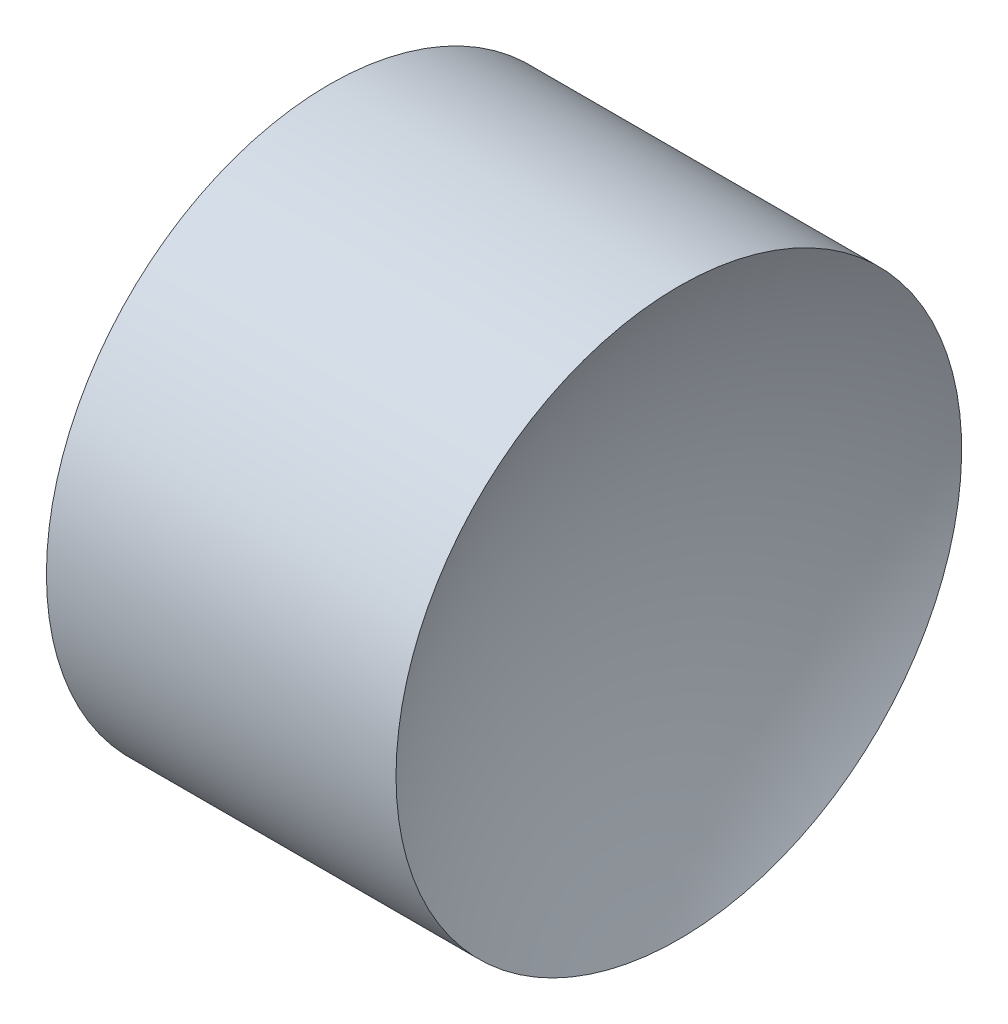
ISO-10303-21;
HEADER;
FILE_DESCRIPTION(('STEP AP214'),'2;1');
FILE_NAME('part.step','',(''),(''),'','','');
FILE_SCHEMA(('AUTOMOTIVE_DESIGN { 1 0 10303 214 1 1 1 1 }'));
ENDSEC;
DATA;
#1=APPLICATION_CONTEXT('core data for automotive mechanical design processes');
#2=APPLICATION_PROTOCOL_DEFINITION('international standard','automotive_design',2000,#1);
#3=PRODUCT_CONTEXT('',#1,'mechanical');
#4=PRODUCT('Part','Part','',(#3));
#5=PRODUCT_RELATED_PRODUCT_CATEGORY('part','',(#4));
#6=PRODUCT_DEFINITION_FORMATION('','',#4);
#7=PRODUCT_DEFINITION_CONTEXT('part definition',#1,'design');
#8=PRODUCT_DEFINITION('design','',#6,#7);
#9=PRODUCT_DEFINITION_SHAPE('','',#8);
#10=(LENGTH_UNIT() NAMED_UNIT(*) SI_UNIT(.MILLI.,.METRE.));
#11=(NAMED_UNIT(*) PLANE_ANGLE_UNIT() SI_UNIT($,.RADIAN.));
#12=(NAMED_UNIT(*) SI_UNIT($,.STERADIAN.) SOLID_ANGLE_UNIT());
#13=UNCERTAINTY_MEASURE_WITH_UNIT(LENGTH_MEASURE(1.E-05),#10,'distance_accuracy_value','');
#14=(GEOMETRIC_REPRESENTATION_CONTEXT(3) GLOBAL_UNCERTAINTY_ASSIGNED_CONTEXT((#13)) GLOBAL_UNIT_ASSIGNED_CONTEXT((#10,
#11,#12)) REPRESENTATION_CONTEXT('',''));
#15=CARTESIAN_POINT('',(0.,0.,0.));
#16=DIRECTION('',(0.,0.,1.));
#17=DIRECTION('',(1.,0.,0.));
#18=AXIS2_PLACEMENT_3D('',#15,#16,#17);
#19=CARTESIAN_POINT('',(1.95091881740694,0.,0.));
#20=DIRECTION('',(-1.,0.,0.));
#21=DIRECTION('',(0.,1.,0.));
#22=AXIS2_PLACEMENT_3D('',#19,#20,#21);
#23=SPHERICAL_SURFACE('',#22,1.31876699611142);
#24=CARTESIAN_POINT('',(0.803466687672227,0.,0.));
#25=DIRECTION('',(-1.,0.,0.));
#26=DIRECTION('',(0.,0.,1.));
#27=AXIS2_PLACEMENT_3D('',#24,#25,#26);
#28=CIRCLE('',#27,0.65);
#29=CARTESIAN_POINT('',(0.803466687672227,0.,0.65));
#30=VERTEX_POINT('',#29);
#31=EDGE_CURVE('E12',#30,#30,#28,.T.);
#32=ORIENTED_EDGE('',*,*,#31,.F.);
#33=EDGE_LOOP('',(#32));
#34=FACE_BOUND('',#33,.T.);
#35=ADVANCED_FACE('F44',(#34),#23,.F.);
#36=CARTESIAN_POINT('',(0.208537409973647,0.,0.));
#37=DIRECTION('',(-1.,0.,0.));
#38=DIRECTION('',(0.,0.,1.));
#39=AXIS2_PLACEMENT_3D('',#36,#37,#38);
#40=CYLINDRICAL_SURFACE('',#39,0.65);
#41=CARTESIAN_POINT('',(0.,0.,0.));
#42=DIRECTION('',(-1.,0.,0.));
#43=DIRECTION('',(0.,0.,1.));
#44=AXIS2_PLACEMENT_3D('',#41,#42,#43);
#45=CIRCLE('',#44,0.65);
#46=CARTESIAN_POINT('',(0.,0.,0.65));
#47=VERTEX_POINT('',#46);
#48=EDGE_CURVE('E50',#47,#47,#45,.T.);
#49=ORIENTED_EDGE('',*,*,#48,.F.);
#50=EDGE_LOOP('',(#49));
#51=FACE_BOUND('',#50,.T.);
#52=ORIENTED_EDGE('',*,*,#31,.T.);
#53=EDGE_LOOP('',(#52));
#54=FACE_BOUND('',#53,.T.);
#55=ADVANCED_FACE('F58',(#51,#54),#40,.T.);
#56=CARTESIAN_POINT('',(-0.908738985224232,0.,0.));
#57=DIRECTION('',(-1.,0.,0.));
#58=DIRECTION('',(0.,1.,0.));
#59=AXIS2_PLACEMENT_3D('',#56,#57,#58);
#60=SPHERICAL_SURFACE('',#59,1.11727639519788);
#61=ORIENTED_EDGE('',*,*,#48,.T.);
#62=EDGE_LOOP('',(#61));
#63=FACE_BOUND('',#62,.T.);
#64=ADVANCED_FACE('F56',(#63),#60,.F.);
#65=CLOSED_SHELL('',(#35,#55,#64));
#66=MANIFOLD_SOLID_BREP('B2',#65);
#67=ADVANCED_BREP_SHAPE_REPRESENTATION('',(#18,#66),#14);
#68=SHAPE_DEFINITION_REPRESENTATION(#9,#67);
ENDSEC;
END-ISO-10303-21;
